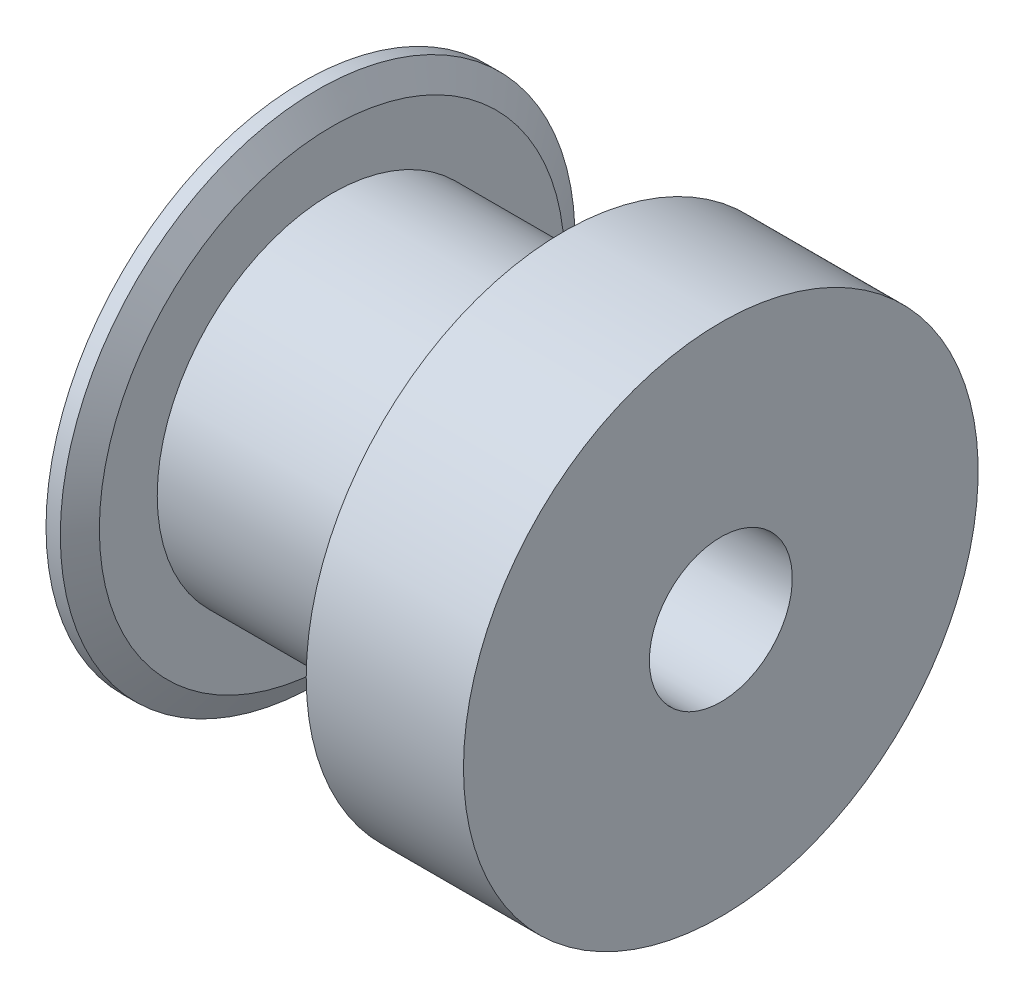
ISO-10303-21;
HEADER;
FILE_DESCRIPTION(('STEP AP214'),'2;1');
FILE_NAME('part.step','',(''),(''),'','','');
FILE_SCHEMA(('AUTOMOTIVE_DESIGN { 1 0 10303 214 1 1 1 1 }'));
ENDSEC;
DATA;
#1=APPLICATION_CONTEXT('core data for automotive mechanical design processes');
#2=APPLICATION_PROTOCOL_DEFINITION('international standard','automotive_design',2000,#1);
#3=PRODUCT_CONTEXT('',#1,'mechanical');
#4=PRODUCT('Part','Part','',(#3));
#5=PRODUCT_RELATED_PRODUCT_CATEGORY('part','',(#4));
#6=PRODUCT_DEFINITION_FORMATION('','',#4);
#7=PRODUCT_DEFINITION_CONTEXT('part definition',#1,'design');
#8=PRODUCT_DEFINITION('design','',#6,#7);
#9=PRODUCT_DEFINITION_SHAPE('','',#8);
#10=(LENGTH_UNIT() NAMED_UNIT(*) SI_UNIT(.MILLI.,.METRE.));
#11=(NAMED_UNIT(*) PLANE_ANGLE_UNIT() SI_UNIT($,.RADIAN.));
#12=(NAMED_UNIT(*) SI_UNIT($,.STERADIAN.) SOLID_ANGLE_UNIT());
#13=UNCERTAINTY_MEASURE_WITH_UNIT(LENGTH_MEASURE(1.E-05),#10,'distance_accuracy_value','');
#14=(GEOMETRIC_REPRESENTATION_CONTEXT(3) GLOBAL_UNCERTAINTY_ASSIGNED_CONTEXT((#13)) GLOBAL_UNIT_ASSIGNED_CONTEXT((#10,
#11,#12)) REPRESENTATION_CONTEXT('',''));
#15=CARTESIAN_POINT('',(0.,0.,0.));
#16=DIRECTION('',(0.,0.,1.));
#17=DIRECTION('',(1.,0.,0.));
#18=AXIS2_PLACEMENT_3D('',#15,#16,#17);
#19=CARTESIAN_POINT('',(0.,9.,0.));
#20=DIRECTION('',(1.,0.,0.));
#21=DIRECTION('',(0.,0.,-1.));
#22=AXIS2_PLACEMENT_3D('',#19,#20,#21);
#23=PLANE('',#22);
#24=CARTESIAN_POINT('',(0.,0.,0.));
#25=DIRECTION('',(-1.,0.,0.));
#26=DIRECTION('',(0.,0.,1.));
#27=AXIS2_PLACEMENT_3D('',#24,#25,#26);
#28=CIRCLE('',#27,2.5);
#29=CARTESIAN_POINT('',(0.,0.,2.5));
#30=VERTEX_POINT('',#29);
#31=EDGE_CURVE('E65',#30,#30,#28,.T.);
#32=ORIENTED_EDGE('',*,*,#31,.F.);
#33=EDGE_LOOP('',(#32));
#34=FACE_BOUND('',#33,.T.);
#35=CARTESIAN_POINT('',(0.,0.,0.));
#36=DIRECTION('',(-1.,0.,0.));
#37=DIRECTION('',(0.,0.,1.));
#38=AXIS2_PLACEMENT_3D('',#35,#36,#37);
#39=CIRCLE('',#38,9.);
#40=CARTESIAN_POINT('',(0.,0.,9.));
#41=VERTEX_POINT('',#40);
#42=EDGE_CURVE('E10',#41,#41,#39,.T.);
#43=ORIENTED_EDGE('',*,*,#42,.T.);
#44=EDGE_LOOP('',(#43));
#45=FACE_BOUND('',#44,.T.);
#46=ADVANCED_FACE('F31',(#34,#45),#23,.F.);
#47=CARTESIAN_POINT('',(0.,0.,0.));
#48=DIRECTION('',(-1.,0.,0.));
#49=DIRECTION('',(0.,0.,1.));
#50=AXIS2_PLACEMENT_3D('',#47,#48,#49);
#51=CYLINDRICAL_SURFACE('',#50,9.);
#52=ORIENTED_EDGE('',*,*,#42,.F.);
#53=EDGE_LOOP('',(#52));
#54=FACE_BOUND('',#53,.T.);
#55=CARTESIAN_POINT('',(0.5,0.,0.));
#56=DIRECTION('',(-1.,0.,0.));
#57=DIRECTION('',(0.,0.,1.));
#58=AXIS2_PLACEMENT_3D('',#55,#56,#57);
#59=CIRCLE('',#58,9.);
#60=CARTESIAN_POINT('',(0.5,0.,9.));
#61=VERTEX_POINT('',#60);
#62=EDGE_CURVE('E37',#61,#61,#59,.T.);
#63=ORIENTED_EDGE('',*,*,#62,.T.);
#64=EDGE_LOOP('',(#63));
#65=FACE_BOUND('',#64,.T.);
#66=ADVANCED_FACE('F72',(#54,#65),#51,.T.);
#67=CARTESIAN_POINT('',(1.,0.,0.));
#68=DIRECTION('',(-1.,0.,0.));
#69=DIRECTION('',(0.,0.,1.));
#70=AXIS2_PLACEMENT_3D('',#67,#68,#69);
#71=CONICAL_SURFACE('',#70,8.13397459621556,1.0471975511966);
#72=ORIENTED_EDGE('',*,*,#62,.F.);
#73=EDGE_LOOP('',(#72));
#74=FACE_BOUND('',#73,.T.);
#75=CARTESIAN_POINT('',(1.,0.,0.));
#76=DIRECTION('',(-1.,0.,0.));
#77=DIRECTION('',(0.,0.,1.));
#78=AXIS2_PLACEMENT_3D('',#75,#76,#77);
#79=CIRCLE('',#78,8.13397459621556);
#80=CARTESIAN_POINT('',(1.,0.,8.13397459621556));
#81=VERTEX_POINT('',#80);
#82=EDGE_CURVE('E41',#81,#81,#79,.T.);
#83=ORIENTED_EDGE('',*,*,#82,.T.);
#84=EDGE_LOOP('',(#83));
#85=FACE_BOUND('',#84,.T.);
#86=ADVANCED_FACE('F76',(#74,#85),#71,.T.);
#87=CARTESIAN_POINT('',(1.,8.13397459621556,0.));
#88=DIRECTION('',(-1.,0.,0.));
#89=DIRECTION('',(0.,0.,1.));
#90=AXIS2_PLACEMENT_3D('',#87,#88,#89);
#91=PLANE('',#90);
#92=ORIENTED_EDGE('',*,*,#82,.F.);
#93=EDGE_LOOP('',(#92));
#94=FACE_BOUND('',#93,.T.);
#95=CARTESIAN_POINT('',(1.,0.,0.));
#96=DIRECTION('',(-1.,0.,0.));
#97=DIRECTION('',(0.,0.,1.));
#98=AXIS2_PLACEMENT_3D('',#95,#96,#97);
#99=CIRCLE('',#98,6.11);
#100=CARTESIAN_POINT('',(1.,0.,6.11));
#101=VERTEX_POINT('',#100);
#102=EDGE_CURVE('E45',#101,#101,#99,.T.);
#103=ORIENTED_EDGE('',*,*,#102,.T.);
#104=EDGE_LOOP('',(#103));
#105=FACE_BOUND('',#104,.T.);
#106=ADVANCED_FACE('F81',(#94,#105),#91,.F.);
#107=CARTESIAN_POINT('',(0.,0.,0.));
#108=DIRECTION('',(-1.,0.,0.));
#109=DIRECTION('',(0.,0.,1.));
#110=AXIS2_PLACEMENT_3D('',#107,#108,#109);
#111=CYLINDRICAL_SURFACE('',#110,6.11);
#112=ORIENTED_EDGE('',*,*,#102,.F.);
#113=EDGE_LOOP('',(#112));
#114=FACE_BOUND('',#113,.T.);
#115=CARTESIAN_POINT('',(8.6,0.,0.));
#116=DIRECTION('',(-1.,0.,0.));
#117=DIRECTION('',(0.,0.,1.));
#118=AXIS2_PLACEMENT_3D('',#115,#116,#117);
#119=CIRCLE('',#118,6.11);
#120=CARTESIAN_POINT('',(8.6,0.,6.11));
#121=VERTEX_POINT('',#120);
#122=EDGE_CURVE('E50',#121,#121,#119,.T.);
#123=ORIENTED_EDGE('',*,*,#122,.T.);
#124=EDGE_LOOP('',(#123));
#125=FACE_BOUND('',#124,.T.);
#126=ADVANCED_FACE('F87',(#114,#125),#111,.T.);
#127=CARTESIAN_POINT('',(8.6,6.11,0.));
#128=DIRECTION('',(1.,0.,0.));
#129=DIRECTION('',(0.,0.,-1.));
#130=AXIS2_PLACEMENT_3D('',#127,#128,#129);
#131=PLANE('',#130);
#132=ORIENTED_EDGE('',*,*,#122,.F.);
#133=EDGE_LOOP('',(#132));
#134=FACE_BOUND('',#133,.T.);
#135=CARTESIAN_POINT('',(8.6,0.,0.));
#136=DIRECTION('',(-1.,0.,0.));
#137=DIRECTION('',(0.,0.,1.));
#138=AXIS2_PLACEMENT_3D('',#135,#136,#137);
#139=CIRCLE('',#138,8.13397459621556);
#140=CARTESIAN_POINT('',(8.6,0.,8.13397459621556));
#141=VERTEX_POINT('',#140);
#142=EDGE_CURVE('E53',#141,#141,#139,.T.);
#143=ORIENTED_EDGE('',*,*,#142,.T.);
#144=EDGE_LOOP('',(#143));
#145=FACE_BOUND('',#144,.T.);
#146=ADVANCED_FACE('F91',(#134,#145),#131,.F.);
#147=CARTESIAN_POINT('',(9.1,0.,0.));
#148=DIRECTION('',(1.,0.,0.));
#149=DIRECTION('',(0.,0.,-1.));
#150=AXIS2_PLACEMENT_3D('',#147,#148,#149);
#151=CONICAL_SURFACE('',#150,9.,1.0471975511966);
#152=ORIENTED_EDGE('',*,*,#142,.F.);
#153=EDGE_LOOP('',(#152));
#154=FACE_BOUND('',#153,.T.);
#155=CARTESIAN_POINT('',(9.1,0.,0.));
#156=DIRECTION('',(-1.,0.,0.));
#157=DIRECTION('',(0.,0.,1.));
#158=AXIS2_PLACEMENT_3D('',#155,#156,#157);
#159=CIRCLE('',#158,9.);
#160=CARTESIAN_POINT('',(9.1,0.,9.));
#161=VERTEX_POINT('',#160);
#162=EDGE_CURVE('E56',#161,#161,#159,.T.);
#163=ORIENTED_EDGE('',*,*,#162,.T.);
#164=EDGE_LOOP('',(#163));
#165=FACE_BOUND('',#164,.T.);
#166=ADVANCED_FACE('F95',(#154,#165),#151,.T.);
#167=CARTESIAN_POINT('',(0.,0.,0.));
#168=DIRECTION('',(-1.,0.,0.));
#169=DIRECTION('',(0.,0.,1.));
#170=AXIS2_PLACEMENT_3D('',#167,#168,#169);
#171=CYLINDRICAL_SURFACE('',#170,9.);
#172=ORIENTED_EDGE('',*,*,#162,.F.);
#173=EDGE_LOOP('',(#172));
#174=FACE_BOUND('',#173,.T.);
#175=CARTESIAN_POINT('',(14.6,0.,0.));
#176=DIRECTION('',(-1.,0.,0.));
#177=DIRECTION('',(0.,0.,1.));
#178=AXIS2_PLACEMENT_3D('',#175,#176,#177);
#179=CIRCLE('',#178,9.);
#180=CARTESIAN_POINT('',(14.6,0.,9.));
#181=VERTEX_POINT('',#180);
#182=EDGE_CURVE('E59',#181,#181,#179,.T.);
#183=ORIENTED_EDGE('',*,*,#182,.T.);
#184=EDGE_LOOP('',(#183));
#185=FACE_BOUND('',#184,.T.);
#186=ADVANCED_FACE('F99',(#174,#185),#171,.T.);
#187=CARTESIAN_POINT('',(14.6,9.,0.));
#188=DIRECTION('',(-1.,0.,0.));
#189=DIRECTION('',(0.,0.,1.));
#190=AXIS2_PLACEMENT_3D('',#187,#188,#189);
#191=PLANE('',#190);
#192=ORIENTED_EDGE('',*,*,#182,.F.);
#193=EDGE_LOOP('',(#192));
#194=FACE_BOUND('',#193,.T.);
#195=CARTESIAN_POINT('',(14.6,0.,0.));
#196=DIRECTION('',(-1.,0.,0.));
#197=DIRECTION('',(0.,0.,1.));
#198=AXIS2_PLACEMENT_3D('',#195,#196,#197);
#199=CIRCLE('',#198,2.5);
#200=CARTESIAN_POINT('',(14.6,0.,2.5));
#201=VERTEX_POINT('',#200);
#202=EDGE_CURVE('E62',#201,#201,#199,.T.);
#203=ORIENTED_EDGE('',*,*,#202,.T.);
#204=EDGE_LOOP('',(#203));
#205=FACE_BOUND('',#204,.T.);
#206=ADVANCED_FACE('F103',(#194,#205),#191,.F.);
#207=CARTESIAN_POINT('',(0.,0.,0.));
#208=DIRECTION('',(-1.,0.,0.));
#209=DIRECTION('',(0.,0.,1.));
#210=AXIS2_PLACEMENT_3D('',#207,#208,#209);
#211=CYLINDRICAL_SURFACE('',#210,2.5);
#212=ORIENTED_EDGE('',*,*,#202,.F.);
#213=EDGE_LOOP('',(#212));
#214=FACE_BOUND('',#213,.T.);
#215=ORIENTED_EDGE('',*,*,#31,.T.);
#216=EDGE_LOOP('',(#215));
#217=FACE_BOUND('',#216,.T.);
#218=ADVANCED_FACE('F69',(#214,#217),#211,.F.);
#219=CLOSED_SHELL('',(#46,#66,#86,#106,#126,#146,#166,#186,#206,#218));
#220=MANIFOLD_SOLID_BREP('B2',#219);
#221=ADVANCED_BREP_SHAPE_REPRESENTATION('',(#18,#220),#14);
#222=SHAPE_DEFINITION_REPRESENTATION(#9,#221);
ENDSEC;
END-ISO-10303-21;
